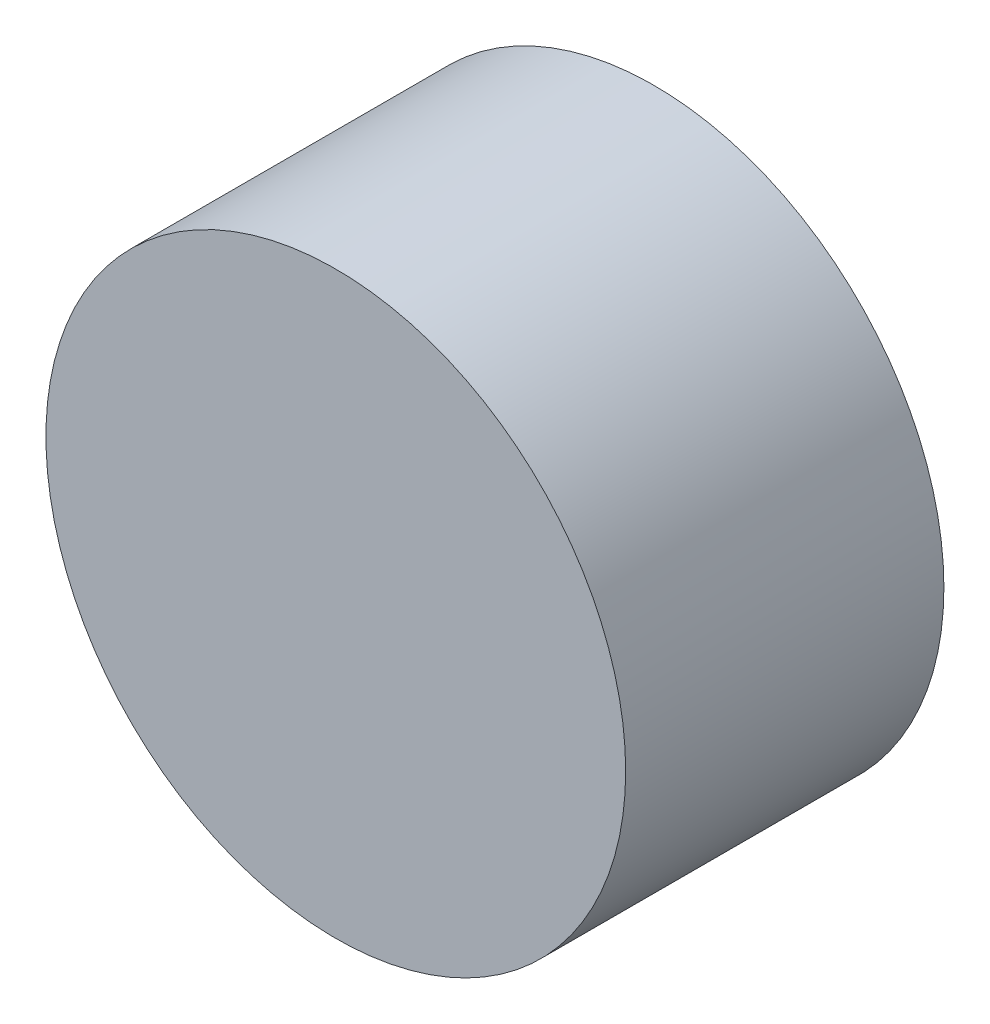
ISO-10303-21;
HEADER;
FILE_DESCRIPTION(('STEP AP214'),'2;1');
FILE_NAME('part.step','',(''),(''),'','','');
FILE_SCHEMA(('AUTOMOTIVE_DESIGN { 1 0 10303 214 1 1 1 1 }'));
ENDSEC;
DATA;
#1=APPLICATION_CONTEXT('core data for automotive mechanical design processes');
#2=APPLICATION_PROTOCOL_DEFINITION('international standard','automotive_design',2000,#1);
#3=PRODUCT_CONTEXT('',#1,'mechanical');
#4=PRODUCT('Part','Part','',(#3));
#5=PRODUCT_RELATED_PRODUCT_CATEGORY('part','',(#4));
#6=PRODUCT_DEFINITION_FORMATION('','',#4);
#7=PRODUCT_DEFINITION_CONTEXT('part definition',#1,'design');
#8=PRODUCT_DEFINITION('design','',#6,#7);
#9=PRODUCT_DEFINITION_SHAPE('','',#8);
#10=(LENGTH_UNIT() NAMED_UNIT(*) SI_UNIT(.MILLI.,.METRE.));
#11=(NAMED_UNIT(*) PLANE_ANGLE_UNIT() SI_UNIT($,.RADIAN.));
#12=(NAMED_UNIT(*) SI_UNIT($,.STERADIAN.) SOLID_ANGLE_UNIT());
#13=UNCERTAINTY_MEASURE_WITH_UNIT(LENGTH_MEASURE(1.E-05),#10,'distance_accuracy_value','');
#14=(GEOMETRIC_REPRESENTATION_CONTEXT(3) GLOBAL_UNCERTAINTY_ASSIGNED_CONTEXT((#13)) GLOBAL_UNIT_ASSIGNED_CONTEXT((#10,
#11,#12)) REPRESENTATION_CONTEXT('',''));
#15=CARTESIAN_POINT('',(0.,0.,0.));
#16=DIRECTION('',(0.,0.,1.));
#17=DIRECTION('',(1.,0.,0.));
#18=AXIS2_PLACEMENT_3D('',#15,#16,#17);
#19=CARTESIAN_POINT('',(0.,0.,2.47));
#20=DIRECTION('',(0.,0.,-1.));
#21=DIRECTION('',(-1.,0.,0.));
#22=AXIS2_PLACEMENT_3D('',#19,#20,#21);
#23=CYLINDRICAL_SURFACE('',#22,2.25);
#24=CARTESIAN_POINT('',(0.,0.,2.47));
#25=DIRECTION('',(0.,0.,1.));
#26=DIRECTION('',(1.,0.,0.));
#27=AXIS2_PLACEMENT_3D('',#24,#25,#26);
#28=CIRCLE('',#27,2.25);
#29=CARTESIAN_POINT('',(2.25,0.,2.47));
#30=VERTEX_POINT('',#29);
#31=EDGE_CURVE('E10',#30,#30,#28,.T.);
#32=ORIENTED_EDGE('',*,*,#31,.F.);
#33=EDGE_LOOP('',(#32));
#34=FACE_BOUND('',#33,.T.);
#35=CARTESIAN_POINT('',(0.,0.,0.));
#36=DIRECTION('',(0.,0.,1.));
#37=DIRECTION('',(1.,0.,0.));
#38=AXIS2_PLACEMENT_3D('',#35,#36,#37);
#39=CIRCLE('',#38,2.25);
#40=CARTESIAN_POINT('',(2.25,0.,0.));
#41=VERTEX_POINT('',#40);
#42=EDGE_CURVE('E35',#41,#41,#39,.T.);
#43=ORIENTED_EDGE('',*,*,#42,.T.);
#44=EDGE_LOOP('',(#43));
#45=FACE_BOUND('',#44,.T.);
#46=ADVANCED_FACE('F32',(#34,#45),#23,.T.);
#47=CARTESIAN_POINT('',(0.,0.,2.47));
#48=DIRECTION('',(0.,0.,1.));
#49=DIRECTION('',(1.,0.,0.));
#50=AXIS2_PLACEMENT_3D('',#47,#48,#49);
#51=PLANE('',#50);
#52=ORIENTED_EDGE('',*,*,#31,.T.);
#53=EDGE_LOOP('',(#52));
#54=FACE_BOUND('',#53,.T.);
#55=ADVANCED_FACE('F47',(#54),#51,.T.);
#56=CARTESIAN_POINT('',(0.,0.,0.));
#57=DIRECTION('',(0.,0.,1.));
#58=DIRECTION('',(1.,0.,0.));
#59=AXIS2_PLACEMENT_3D('',#56,#57,#58);
#60=PLANE('',#59);
#61=ORIENTED_EDGE('',*,*,#42,.F.);
#62=EDGE_LOOP('',(#61));
#63=FACE_BOUND('',#62,.T.);
#64=ADVANCED_FACE('F45',(#63),#60,.F.);
#65=CLOSED_SHELL('',(#46,#55,#64));
#66=MANIFOLD_SOLID_BREP('B2',#65);
#67=ADVANCED_BREP_SHAPE_REPRESENTATION('',(#18,#66),#14);
#68=SHAPE_DEFINITION_REPRESENTATION(#9,#67);
ENDSEC;
END-ISO-10303-21;
